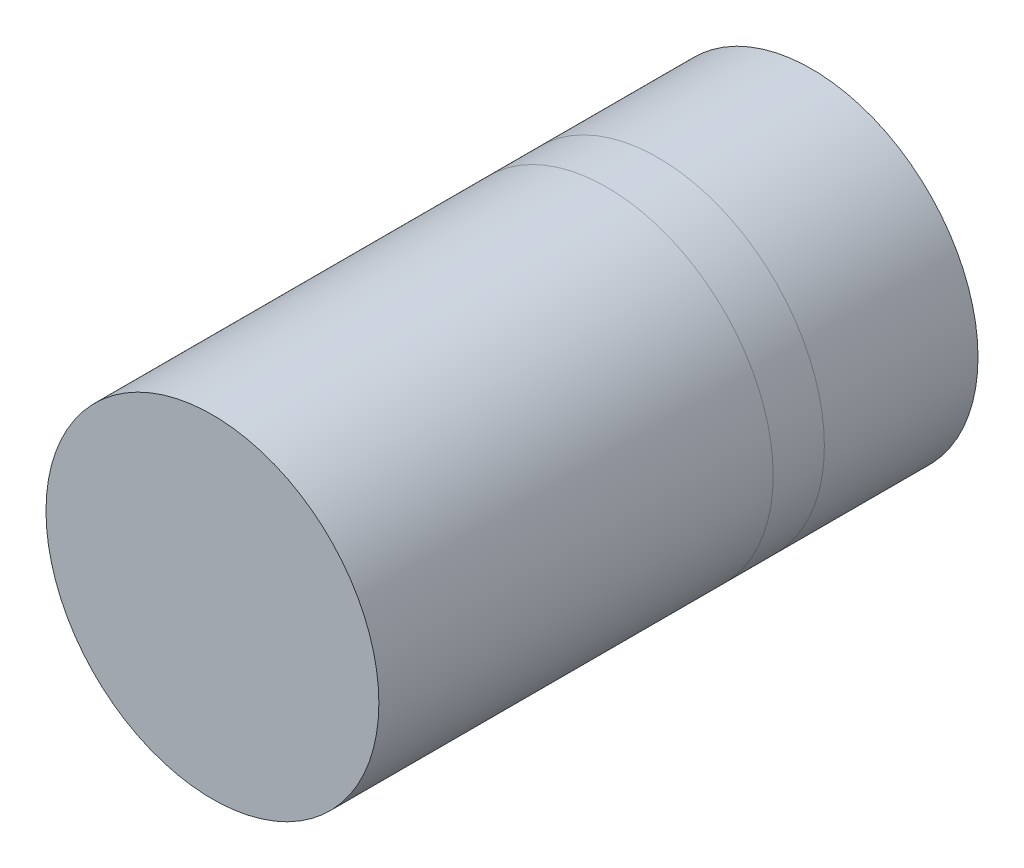
ISO-10303-21;
HEADER;
FILE_DESCRIPTION(('STEP AP214'),'2;1');
FILE_NAME('part.step','',(''),(''),'','','');
FILE_SCHEMA(('AUTOMOTIVE_DESIGN { 1 0 10303 214 1 1 1 1 }'));
ENDSEC;
DATA;
#1=APPLICATION_CONTEXT('core data for automotive mechanical design processes');
#2=APPLICATION_PROTOCOL_DEFINITION('international standard','automotive_design',2000,#1);
#3=PRODUCT_CONTEXT('',#1,'mechanical');
#4=PRODUCT('Part','Part','',(#3));
#5=PRODUCT_RELATED_PRODUCT_CATEGORY('part','',(#4));
#6=PRODUCT_DEFINITION_FORMATION('','',#4);
#7=PRODUCT_DEFINITION_CONTEXT('part definition',#1,'design');
#8=PRODUCT_DEFINITION('design','',#6,#7);
#9=PRODUCT_DEFINITION_SHAPE('','',#8);
#10=(LENGTH_UNIT() NAMED_UNIT(*) SI_UNIT(.MILLI.,.METRE.));
#11=(NAMED_UNIT(*) PLANE_ANGLE_UNIT() SI_UNIT($,.RADIAN.));
#12=(NAMED_UNIT(*) SI_UNIT($,.STERADIAN.) SOLID_ANGLE_UNIT());
#13=UNCERTAINTY_MEASURE_WITH_UNIT(LENGTH_MEASURE(1.E-05),#10,'distance_accuracy_value','');
#14=(GEOMETRIC_REPRESENTATION_CONTEXT(3) GLOBAL_UNCERTAINTY_ASSIGNED_CONTEXT((#13)) GLOBAL_UNIT_ASSIGNED_CONTEXT((#10,
#11,#12)) REPRESENTATION_CONTEXT('',''));
#15=CARTESIAN_POINT('',(0.,0.,0.));
#16=DIRECTION('',(0.,0.,1.));
#17=DIRECTION('',(1.,0.,0.));
#18=AXIS2_PLACEMENT_3D('',#15,#16,#17);
#19=CARTESIAN_POINT('',(0.,0.,234.));
#20=DIRECTION('',(0.,0.,-1.));
#21=DIRECTION('',(-1.,0.,0.));
#22=AXIS2_PLACEMENT_3D('',#19,#20,#21);
#23=CYLINDRICAL_SURFACE('',#22,65.);
#24=CARTESIAN_POINT('',(0.,0.,60.));
#25=DIRECTION('',(0.,0.,1.));
#26=DIRECTION('',(1.,0.,0.));
#27=AXIS2_PLACEMENT_3D('',#24,#25,#26);
#28=CIRCLE('',#27,65.);
#29=CARTESIAN_POINT('',(65.,0.,60.));
#30=VERTEX_POINT('',#29);
#31=EDGE_CURVE('E53',#30,#30,#28,.T.);
#32=ORIENTED_EDGE('',*,*,#31,.T.);
#33=EDGE_LOOP('',(#32));
#34=FACE_BOUND('',#33,.T.);
#35=CARTESIAN_POINT('',(0.,0.,80.));
#36=DIRECTION('',(0.,0.,1.));
#37=DIRECTION('',(1.,0.,0.));
#38=AXIS2_PLACEMENT_3D('',#35,#36,#37);
#39=CIRCLE('',#38,65.);
#40=CARTESIAN_POINT('',(65.,0.,80.));
#41=VERTEX_POINT('',#40);
#42=EDGE_CURVE('E10',#41,#41,#39,.T.);
#43=ORIENTED_EDGE('',*,*,#42,.F.);
#44=EDGE_LOOP('',(#43));
#45=FACE_BOUND('',#44,.T.);
#46=ADVANCED_FACE('F45',(#34,#45),#23,.T.);
#47=CARTESIAN_POINT('',(0.,0.,0.));
#48=DIRECTION('',(0.,0.,1.));
#49=DIRECTION('',(1.,0.,0.));
#50=AXIS2_PLACEMENT_3D('',#47,#48,#49);
#51=CIRCLE('',#50,65.);
#52=CARTESIAN_POINT('',(65.,0.,0.));
#53=VERTEX_POINT('',#52);
#54=EDGE_CURVE('E65',#53,#53,#51,.T.);
#55=ORIENTED_EDGE('',*,*,#54,.T.);
#56=EDGE_LOOP('',(#55));
#57=FACE_BOUND('',#56,.T.);
#58=ORIENTED_EDGE('',*,*,#31,.F.);
#59=EDGE_LOOP('',(#58));
#60=FACE_BOUND('',#59,.T.);
#61=ADVANCED_FACE('F72',(#57,#60),#23,.T.);
#62=ORIENTED_EDGE('',*,*,#42,.T.);
#63=EDGE_LOOP('',(#62));
#64=FACE_BOUND('',#63,.T.);
#65=CARTESIAN_POINT('',(0.,0.,234.));
#66=DIRECTION('',(0.,0.,1.));
#67=DIRECTION('',(1.,0.,0.));
#68=AXIS2_PLACEMENT_3D('',#65,#66,#67);
#69=CIRCLE('',#68,65.);
#70=CARTESIAN_POINT('',(65.,0.,234.));
#71=VERTEX_POINT('',#70);
#72=EDGE_CURVE('E59',#71,#71,#69,.T.);
#73=ORIENTED_EDGE('',*,*,#72,.F.);
#74=EDGE_LOOP('',(#73));
#75=FACE_BOUND('',#74,.T.);
#76=ADVANCED_FACE('F47',(#64,#75),#23,.T.);
#77=CARTESIAN_POINT('',(0.,0.,234.));
#78=DIRECTION('',(0.,0.,1.));
#79=DIRECTION('',(1.,0.,0.));
#80=AXIS2_PLACEMENT_3D('',#77,#78,#79);
#81=PLANE('',#80);
#82=ORIENTED_EDGE('',*,*,#72,.T.);
#83=EDGE_LOOP('',(#82));
#84=FACE_BOUND('',#83,.T.);
#85=ADVANCED_FACE('F77',(#84),#81,.T.);
#86=CARTESIAN_POINT('',(0.,0.,0.));
#87=DIRECTION('',(0.,0.,1.));
#88=DIRECTION('',(1.,0.,0.));
#89=AXIS2_PLACEMENT_3D('',#86,#87,#88);
#90=PLANE('',#89);
#91=ORIENTED_EDGE('',*,*,#54,.F.);
#92=EDGE_LOOP('',(#91));
#93=FACE_BOUND('',#92,.T.);
#94=ADVANCED_FACE('F75',(#93),#90,.F.);
#95=CLOSED_SHELL('',(#46,#61,#76,#85,#94));
#96=MANIFOLD_SOLID_BREP('B2',#95);
#97=ADVANCED_BREP_SHAPE_REPRESENTATION('',(#18,#96),#14);
#98=SHAPE_DEFINITION_REPRESENTATION(#9,#97);
ENDSEC;
END-ISO-10303-21;
